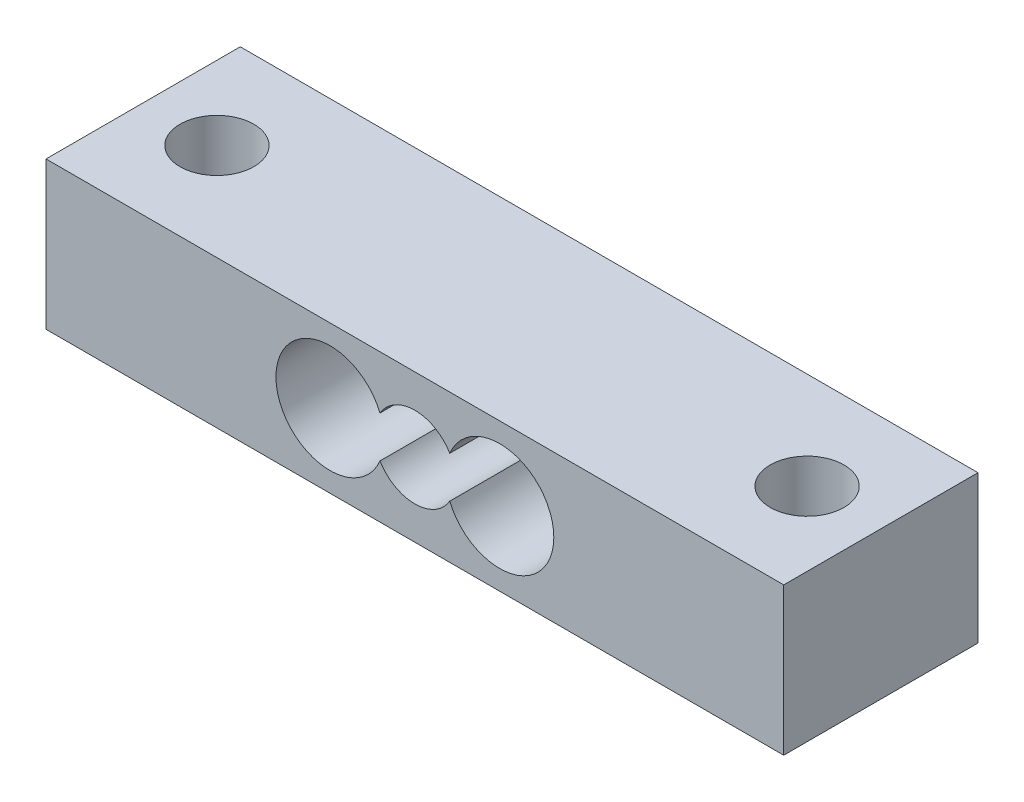
ISO-10303-21;
HEADER;
FILE_DESCRIPTION(('STEP AP214'),'2;1');
FILE_NAME('part.step','',(''),(''),'','','');
FILE_SCHEMA(('AUTOMOTIVE_DESIGN { 1 0 10303 214 1 1 1 1 }'));
ENDSEC;
DATA;
#1=APPLICATION_CONTEXT('core data for automotive mechanical design processes');
#2=APPLICATION_PROTOCOL_DEFINITION('international standard','automotive_design',2000,#1);
#3=PRODUCT_CONTEXT('',#1,'mechanical');
#4=PRODUCT('Part','Part','',(#3));
#5=PRODUCT_RELATED_PRODUCT_CATEGORY('part','',(#4));
#6=PRODUCT_DEFINITION_FORMATION('','',#4);
#7=PRODUCT_DEFINITION_CONTEXT('part definition',#1,'design');
#8=PRODUCT_DEFINITION('design','',#6,#7);
#9=PRODUCT_DEFINITION_SHAPE('','',#8);
#10=(LENGTH_UNIT() NAMED_UNIT(*) SI_UNIT(.MILLI.,.METRE.));
#11=(NAMED_UNIT(*) PLANE_ANGLE_UNIT() SI_UNIT($,.RADIAN.));
#12=(NAMED_UNIT(*) SI_UNIT($,.STERADIAN.) SOLID_ANGLE_UNIT());
#13=UNCERTAINTY_MEASURE_WITH_UNIT(LENGTH_MEASURE(1.E-05),#10,'distance_accuracy_value','');
#14=(GEOMETRIC_REPRESENTATION_CONTEXT(3) GLOBAL_UNCERTAINTY_ASSIGNED_CONTEXT((#13)) GLOBAL_UNIT_ASSIGNED_CONTEXT((#10,
#11,#12)) REPRESENTATION_CONTEXT('',''));
#15=CARTESIAN_POINT('',(0.,0.,0.));
#16=DIRECTION('',(0.,0.,1.));
#17=DIRECTION('',(1.,0.,0.));
#18=AXIS2_PLACEMENT_3D('',#15,#16,#17);
#19=CARTESIAN_POINT('',(0.,0.,7.9));
#20=DIRECTION('',(0.,0.,-1.));
#21=DIRECTION('',(-1.,0.,0.));
#22=AXIS2_PLACEMENT_3D('',#19,#20,#21);
#23=PLANE('',#22);
#24=DIRECTION('',(0.,-1.,0.));
#25=VECTOR('',#24,1.);
#26=CARTESIAN_POINT('',(0.,0.,7.9));
#27=LINE('',#26,#25);
#28=CARTESIAN_POINT('',(0.,6.,7.9));
#29=VERTEX_POINT('',#28);
#30=CARTESIAN_POINT('',(0.,0.,7.9));
#31=VERTEX_POINT('',#30);
#32=EDGE_CURVE('E149',#29,#31,#27,.T.);
#33=ORIENTED_EDGE('',*,*,#32,.T.);
#34=DIRECTION('',(1.,0.,0.));
#35=VECTOR('',#34,1.);
#36=CARTESIAN_POINT('',(0.,0.,7.9));
#37=LINE('',#36,#35);
#38=CARTESIAN_POINT('',(30.,0.,7.9));
#39=VERTEX_POINT('',#38);
#40=EDGE_CURVE('E152',#31,#39,#37,.T.);
#41=ORIENTED_EDGE('',*,*,#40,.T.);
#42=DIRECTION('',(0.,1.,0.));
#43=VECTOR('',#42,1.);
#44=CARTESIAN_POINT('',(30.,0.,7.9));
#45=LINE('',#44,#43);
#46=CARTESIAN_POINT('',(30.,6.,7.9));
#47=VERTEX_POINT('',#46);
#48=EDGE_CURVE('E155',#39,#47,#45,.T.);
#49=ORIENTED_EDGE('',*,*,#48,.T.);
#50=DIRECTION('',(-1.,0.,0.));
#51=VECTOR('',#50,1.);
#52=CARTESIAN_POINT('',(0.,6.,7.9));
#53=LINE('',#52,#51);
#54=EDGE_CURVE('E157',#47,#29,#53,.T.);
#55=ORIENTED_EDGE('',*,*,#54,.T.);
#56=EDGE_LOOP('',(#33,#41,#49,#55));
#57=FACE_BOUND('',#56,.T.);
#58=CARTESIAN_POINT('',(15.,3.,7.9));
#59=DIRECTION('',(0.,0.,1.));
#60=DIRECTION('',(1.,0.,0.));
#61=AXIS2_PLACEMENT_3D('',#58,#59,#60);
#62=CIRCLE('',#61,1.65);
#63=CARTESIAN_POINT('',(16.418115942029,3.84347328052716,7.9));
#64=VERTEX_POINT('',#63);
#65=CARTESIAN_POINT('',(13.581884057971,3.84347328052716,7.9));
#66=VERTEX_POINT('',#65);
#67=EDGE_CURVE('E111',#64,#66,#62,.T.);
#68=ORIENTED_EDGE('',*,*,#67,.F.);
#69=CARTESIAN_POINT('',(18.45,3.,7.9));
#70=DIRECTION('',(0.,0.,1.));
#71=DIRECTION('',(1.,0.,0.));
#72=AXIS2_PLACEMENT_3D('',#69,#70,#71);
#73=CIRCLE('',#72,2.2);
#74=CARTESIAN_POINT('',(16.418115942029,2.15652671947284,7.9));
#75=VERTEX_POINT('',#74);
#76=EDGE_CURVE('E133',#75,#64,#73,.T.);
#77=ORIENTED_EDGE('',*,*,#76,.F.);
#78=CARTESIAN_POINT('',(15.,3.,7.9));
#79=DIRECTION('',(0.,0.,1.));
#80=DIRECTION('',(1.,0.,0.));
#81=AXIS2_PLACEMENT_3D('',#78,#79,#80);
#82=CIRCLE('',#81,1.65);
#83=CARTESIAN_POINT('',(13.581884057971,2.15652671947285,7.9));
#84=VERTEX_POINT('',#83);
#85=EDGE_CURVE('E131',#84,#75,#82,.T.);
#86=ORIENTED_EDGE('',*,*,#85,.F.);
#87=CARTESIAN_POINT('',(11.55,3.,7.9));
#88=DIRECTION('',(0.,0.,1.));
#89=DIRECTION('',(1.,0.,0.));
#90=AXIS2_PLACEMENT_3D('',#87,#88,#89);
#91=CIRCLE('',#90,2.2);
#92=EDGE_CURVE('E119',#66,#84,#91,.T.);
#93=ORIENTED_EDGE('',*,*,#92,.F.);
#94=EDGE_LOOP('',(#68,#77,#86,#93));
#95=FACE_BOUND('',#94,.T.);
#96=ADVANCED_FACE('F46',(#57,#95),#23,.F.);
#97=CARTESIAN_POINT('',(0.,0.,0.));
#98=DIRECTION('',(0.,0.,-1.));
#99=DIRECTION('',(-1.,0.,0.));
#100=AXIS2_PLACEMENT_3D('',#97,#98,#99);
#101=PLANE('',#100);
#102=DIRECTION('',(0.,-1.,0.));
#103=VECTOR('',#102,1.);
#104=CARTESIAN_POINT('',(0.,0.,0.));
#105=LINE('',#104,#103);
#106=CARTESIAN_POINT('',(0.,6.,0.));
#107=VERTEX_POINT('',#106);
#108=CARTESIAN_POINT('',(0.,0.,0.));
#109=VERTEX_POINT('',#108);
#110=EDGE_CURVE('E127',#107,#109,#105,.T.);
#111=ORIENTED_EDGE('',*,*,#110,.F.);
#112=DIRECTION('',(-1.,0.,0.));
#113=VECTOR('',#112,1.);
#114=CARTESIAN_POINT('',(0.,6.,0.));
#115=LINE('',#114,#113);
#116=CARTESIAN_POINT('',(30.,6.,0.));
#117=VERTEX_POINT('',#116);
#118=EDGE_CURVE('E153',#117,#107,#115,.T.);
#119=ORIENTED_EDGE('',*,*,#118,.F.);
#120=DIRECTION('',(0.,1.,0.));
#121=VECTOR('',#120,1.);
#122=CARTESIAN_POINT('',(30.,0.,0.));
#123=LINE('',#122,#121);
#124=CARTESIAN_POINT('',(30.,0.,0.));
#125=VERTEX_POINT('',#124);
#126=EDGE_CURVE('E164',#125,#117,#123,.T.);
#127=ORIENTED_EDGE('',*,*,#126,.F.);
#128=DIRECTION('',(1.,0.,0.));
#129=VECTOR('',#128,1.);
#130=CARTESIAN_POINT('',(0.,0.,0.));
#131=LINE('',#130,#129);
#132=EDGE_CURVE('E162',#109,#125,#131,.T.);
#133=ORIENTED_EDGE('',*,*,#132,.F.);
#134=EDGE_LOOP('',(#111,#119,#127,#133));
#135=FACE_BOUND('',#134,.T.);
#136=CARTESIAN_POINT('',(18.45,3.,0.));
#137=DIRECTION('',(0.,0.,1.));
#138=DIRECTION('',(1.,0.,0.));
#139=AXIS2_PLACEMENT_3D('',#136,#137,#138);
#140=CIRCLE('',#139,2.2);
#141=CARTESIAN_POINT('',(16.418115942029,2.15652671947284,0.));
#142=VERTEX_POINT('',#141);
#143=CARTESIAN_POINT('',(16.418115942029,3.84347328052716,0.));
#144=VERTEX_POINT('',#143);
#145=EDGE_CURVE('E120',#142,#144,#140,.T.);
#146=ORIENTED_EDGE('',*,*,#145,.T.);
#147=CARTESIAN_POINT('',(15.,3.,0.));
#148=DIRECTION('',(0.,0.,1.));
#149=DIRECTION('',(1.,0.,0.));
#150=AXIS2_PLACEMENT_3D('',#147,#148,#149);
#151=CIRCLE('',#150,1.65);
#152=CARTESIAN_POINT('',(13.581884057971,3.84347328052716,0.));
#153=VERTEX_POINT('',#152);
#154=EDGE_CURVE('E69',#144,#153,#151,.T.);
#155=ORIENTED_EDGE('',*,*,#154,.T.);
#156=CARTESIAN_POINT('',(11.55,3.,0.));
#157=DIRECTION('',(0.,0.,1.));
#158=DIRECTION('',(1.,0.,0.));
#159=AXIS2_PLACEMENT_3D('',#156,#157,#158);
#160=CIRCLE('',#159,2.2);
#161=CARTESIAN_POINT('',(13.581884057971,2.15652671947285,0.));
#162=VERTEX_POINT('',#161);
#163=EDGE_CURVE('E126',#153,#162,#160,.T.);
#164=ORIENTED_EDGE('',*,*,#163,.T.);
#165=CARTESIAN_POINT('',(15.,3.,0.));
#166=DIRECTION('',(0.,0.,1.));
#167=DIRECTION('',(1.,0.,0.));
#168=AXIS2_PLACEMENT_3D('',#165,#166,#167);
#169=CIRCLE('',#168,1.65);
#170=EDGE_CURVE('E141',#162,#142,#169,.T.);
#171=ORIENTED_EDGE('',*,*,#170,.T.);
#172=EDGE_LOOP('',(#146,#155,#164,#171));
#173=FACE_BOUND('',#172,.T.);
#174=ADVANCED_FACE('F182',(#135,#173),#101,.T.);
#175=CARTESIAN_POINT('',(0.,0.,7.9));
#176=DIRECTION('',(1.,0.,0.));
#177=DIRECTION('',(0.,0.,-1.));
#178=AXIS2_PLACEMENT_3D('',#175,#176,#177);
#179=PLANE('',#178);
#180=ORIENTED_EDGE('',*,*,#110,.T.);
#181=DIRECTION('',(0.,0.,-1.));
#182=VECTOR('',#181,1.);
#183=CARTESIAN_POINT('',(0.,0.,7.9));
#184=LINE('',#183,#182);
#185=EDGE_CURVE('E13',#31,#109,#184,.T.);
#186=ORIENTED_EDGE('',*,*,#185,.F.);
#187=ORIENTED_EDGE('',*,*,#32,.F.);
#188=DIRECTION('',(0.,0.,-1.));
#189=VECTOR('',#188,1.);
#190=CARTESIAN_POINT('',(0.,6.,7.9));
#191=LINE('',#190,#189);
#192=EDGE_CURVE('E159',#29,#107,#191,.T.);
#193=ORIENTED_EDGE('',*,*,#192,.T.);
#194=EDGE_LOOP('',(#180,#186,#187,#193));
#195=FACE_BOUND('',#194,.T.);
#196=ADVANCED_FACE('F48',(#195),#179,.F.);
#197=CARTESIAN_POINT('',(0.,0.,7.9));
#198=DIRECTION('',(0.,1.,0.));
#199=DIRECTION('',(0.,0.,1.));
#200=AXIS2_PLACEMENT_3D('',#197,#198,#199);
#201=PLANE('',#200);
#202=CARTESIAN_POINT('',(3.,0.,3.95));
#203=DIRECTION('',(0.,1.,0.));
#204=DIRECTION('',(0.,0.,1.));
#205=AXIS2_PLACEMENT_3D('',#202,#203,#204);
#206=CIRCLE('',#205,1.5);
#207=CARTESIAN_POINT('',(3.,0.,5.45));
#208=VERTEX_POINT('',#207);
#209=EDGE_CURVE('E139',#208,#208,#206,.T.);
#210=ORIENTED_EDGE('',*,*,#209,.T.);
#211=EDGE_LOOP('',(#210));
#212=FACE_BOUND('',#211,.T.);
#213=CARTESIAN_POINT('',(27.,0.,3.95));
#214=DIRECTION('',(0.,1.,0.));
#215=DIRECTION('',(0.,0.,1.));
#216=AXIS2_PLACEMENT_3D('',#213,#214,#215);
#217=CIRCLE('',#216,1.5);
#218=CARTESIAN_POINT('',(27.,0.,5.45));
#219=VERTEX_POINT('',#218);
#220=EDGE_CURVE('E224',#219,#219,#217,.T.);
#221=ORIENTED_EDGE('',*,*,#220,.T.);
#222=EDGE_LOOP('',(#221));
#223=FACE_BOUND('',#222,.T.);
#224=ORIENTED_EDGE('',*,*,#132,.T.);
#225=DIRECTION('',(0.,0.,-1.));
#226=VECTOR('',#225,1.);
#227=CARTESIAN_POINT('',(30.,0.,7.9));
#228=LINE('',#227,#226);
#229=EDGE_CURVE('E54',#39,#125,#228,.T.);
#230=ORIENTED_EDGE('',*,*,#229,.F.);
#231=ORIENTED_EDGE('',*,*,#40,.F.);
#232=ORIENTED_EDGE('',*,*,#185,.T.);
#233=EDGE_LOOP('',(#224,#230,#231,#232));
#234=FACE_BOUND('',#233,.T.);
#235=ADVANCED_FACE('F192',(#212,#223,#234),#201,.F.);
#236=CARTESIAN_POINT('',(30.,0.,7.9));
#237=DIRECTION('',(-1.,0.,0.));
#238=DIRECTION('',(0.,0.,1.));
#239=AXIS2_PLACEMENT_3D('',#236,#237,#238);
#240=PLANE('',#239);
#241=ORIENTED_EDGE('',*,*,#126,.T.);
#242=DIRECTION('',(0.,0.,-1.));
#243=VECTOR('',#242,1.);
#244=CARTESIAN_POINT('',(30.,6.,7.9));
#245=LINE('',#244,#243);
#246=EDGE_CURVE('E169',#47,#117,#245,.T.);
#247=ORIENTED_EDGE('',*,*,#246,.F.);
#248=ORIENTED_EDGE('',*,*,#48,.F.);
#249=ORIENTED_EDGE('',*,*,#229,.T.);
#250=EDGE_LOOP('',(#241,#247,#248,#249));
#251=FACE_BOUND('',#250,.T.);
#252=ADVANCED_FACE('F176',(#251),#240,.F.);
#253=CARTESIAN_POINT('',(0.,6.,7.9));
#254=DIRECTION('',(0.,-1.,0.));
#255=DIRECTION('',(0.,0.,-1.));
#256=AXIS2_PLACEMENT_3D('',#253,#254,#255);
#257=PLANE('',#256);
#258=CARTESIAN_POINT('',(3.,6.,3.95));
#259=DIRECTION('',(0.,1.,0.));
#260=DIRECTION('',(0.,0.,1.));
#261=AXIS2_PLACEMENT_3D('',#258,#259,#260);
#262=CIRCLE('',#261,1.5);
#263=CARTESIAN_POINT('',(3.,6.,5.45));
#264=VERTEX_POINT('',#263);
#265=EDGE_CURVE('E219',#264,#264,#262,.T.);
#266=ORIENTED_EDGE('',*,*,#265,.F.);
#267=EDGE_LOOP('',(#266));
#268=FACE_BOUND('',#267,.T.);
#269=CARTESIAN_POINT('',(27.,6.,3.95));
#270=DIRECTION('',(0.,1.,0.));
#271=DIRECTION('',(0.,0.,1.));
#272=AXIS2_PLACEMENT_3D('',#269,#270,#271);
#273=CIRCLE('',#272,1.5);
#274=CARTESIAN_POINT('',(27.,6.,5.45));
#275=VERTEX_POINT('',#274);
#276=EDGE_CURVE('E222',#275,#275,#273,.T.);
#277=ORIENTED_EDGE('',*,*,#276,.F.);
#278=EDGE_LOOP('',(#277));
#279=FACE_BOUND('',#278,.T.);
#280=ORIENTED_EDGE('',*,*,#118,.T.);
#281=ORIENTED_EDGE('',*,*,#192,.F.);
#282=ORIENTED_EDGE('',*,*,#54,.F.);
#283=ORIENTED_EDGE('',*,*,#246,.T.);
#284=EDGE_LOOP('',(#280,#281,#282,#283));
#285=FACE_BOUND('',#284,.T.);
#286=ADVANCED_FACE('F186',(#268,#279,#285),#257,.F.);
#287=CARTESIAN_POINT('',(15.,3.,7.9));
#288=DIRECTION('',(0.,0.,-1.));
#289=DIRECTION('',(-1.,0.,0.));
#290=AXIS2_PLACEMENT_3D('',#287,#288,#289);
#291=CYLINDRICAL_SURFACE('',#290,1.65);
#292=ORIENTED_EDGE('',*,*,#154,.F.);
#293=DIRECTION('',(0.,0.,-1.));
#294=VECTOR('',#293,1.);
#295=CARTESIAN_POINT('',(16.418115942029,3.84347328052716,7.9));
#296=LINE('',#295,#294);
#297=EDGE_CURVE('E115',#64,#144,#296,.T.);
#298=ORIENTED_EDGE('',*,*,#297,.F.);
#299=ORIENTED_EDGE('',*,*,#67,.T.);
#300=DIRECTION('',(0.,0.,-1.));
#301=VECTOR('',#300,1.);
#302=CARTESIAN_POINT('',(13.581884057971,3.84347328052716,7.9));
#303=LINE('',#302,#301);
#304=EDGE_CURVE('E114',#66,#153,#303,.T.);
#305=ORIENTED_EDGE('',*,*,#304,.T.);
#306=EDGE_LOOP('',(#292,#298,#299,#305));
#307=FACE_BOUND('',#306,.T.);
#308=ADVANCED_FACE('F113',(#307),#291,.F.);
#309=CARTESIAN_POINT('',(11.55,3.,7.9));
#310=DIRECTION('',(0.,0.,-1.));
#311=DIRECTION('',(-1.,0.,0.));
#312=AXIS2_PLACEMENT_3D('',#309,#310,#311);
#313=CYLINDRICAL_SURFACE('',#312,2.2);
#314=ORIENTED_EDGE('',*,*,#163,.F.);
#315=ORIENTED_EDGE('',*,*,#304,.F.);
#316=ORIENTED_EDGE('',*,*,#92,.T.);
#317=DIRECTION('',(0.,0.,-1.));
#318=VECTOR('',#317,1.);
#319=CARTESIAN_POINT('',(13.581884057971,2.15652671947285,7.9));
#320=LINE('',#319,#318);
#321=EDGE_CURVE('E128',#84,#162,#320,.T.);
#322=ORIENTED_EDGE('',*,*,#321,.T.);
#323=EDGE_LOOP('',(#314,#315,#316,#322));
#324=FACE_BOUND('',#323,.T.);
#325=ADVANCED_FACE('F123',(#324),#313,.F.);
#326=CARTESIAN_POINT('',(15.,3.,7.9));
#327=DIRECTION('',(0.,0.,-1.));
#328=DIRECTION('',(-1.,0.,0.));
#329=AXIS2_PLACEMENT_3D('',#326,#327,#328);
#330=CYLINDRICAL_SURFACE('',#329,1.65);
#331=ORIENTED_EDGE('',*,*,#170,.F.);
#332=ORIENTED_EDGE('',*,*,#321,.F.);
#333=ORIENTED_EDGE('',*,*,#85,.T.);
#334=DIRECTION('',(0.,0.,-1.));
#335=VECTOR('',#334,1.);
#336=CARTESIAN_POINT('',(16.418115942029,2.15652671947284,7.9));
#337=LINE('',#336,#335);
#338=EDGE_CURVE('E61',#75,#142,#337,.T.);
#339=ORIENTED_EDGE('',*,*,#338,.T.);
#340=EDGE_LOOP('',(#331,#332,#333,#339));
#341=FACE_BOUND('',#340,.T.);
#342=ADVANCED_FACE('F245',(#341),#330,.F.);
#343=CARTESIAN_POINT('',(18.45,3.,7.9));
#344=DIRECTION('',(0.,0.,-1.));
#345=DIRECTION('',(-1.,0.,0.));
#346=AXIS2_PLACEMENT_3D('',#343,#344,#345);
#347=CYLINDRICAL_SURFACE('',#346,2.2);
#348=ORIENTED_EDGE('',*,*,#145,.F.);
#349=ORIENTED_EDGE('',*,*,#338,.F.);
#350=ORIENTED_EDGE('',*,*,#76,.T.);
#351=ORIENTED_EDGE('',*,*,#297,.T.);
#352=EDGE_LOOP('',(#348,#349,#350,#351));
#353=FACE_BOUND('',#352,.T.);
#354=ADVANCED_FACE('F239',(#353),#347,.F.);
#355=CARTESIAN_POINT('',(27.,0.,3.95));
#356=DIRECTION('',(0.,1.,0.));
#357=DIRECTION('',(0.,0.,1.));
#358=AXIS2_PLACEMENT_3D('',#355,#356,#357);
#359=CYLINDRICAL_SURFACE('',#358,1.5);
#360=ORIENTED_EDGE('',*,*,#220,.F.);
#361=EDGE_LOOP('',(#360));
#362=FACE_BOUND('',#361,.T.);
#363=ORIENTED_EDGE('',*,*,#276,.T.);
#364=EDGE_LOOP('',(#363));
#365=FACE_BOUND('',#364,.T.);
#366=ADVANCED_FACE('F234',(#362,#365),#359,.F.);
#367=CARTESIAN_POINT('',(3.,0.,3.95));
#368=DIRECTION('',(0.,1.,0.));
#369=DIRECTION('',(0.,0.,1.));
#370=AXIS2_PLACEMENT_3D('',#367,#368,#369);
#371=CYLINDRICAL_SURFACE('',#370,1.5);
#372=ORIENTED_EDGE('',*,*,#209,.F.);
#373=EDGE_LOOP('',(#372));
#374=FACE_BOUND('',#373,.T.);
#375=ORIENTED_EDGE('',*,*,#265,.T.);
#376=EDGE_LOOP('',(#375));
#377=FACE_BOUND('',#376,.T.);
#378=ADVANCED_FACE('F231',(#374,#377),#371,.F.);
#379=CLOSED_SHELL('',(#96,#174,#196,#235,#252,#286,#308,#325,#342,#354,#366,#378));
#380=MANIFOLD_SOLID_BREP('B2',#379);
#381=ADVANCED_BREP_SHAPE_REPRESENTATION('',(#18,#380),#14);
#382=SHAPE_DEFINITION_REPRESENTATION(#9,#381);
ENDSEC;
END-ISO-10303-21;
